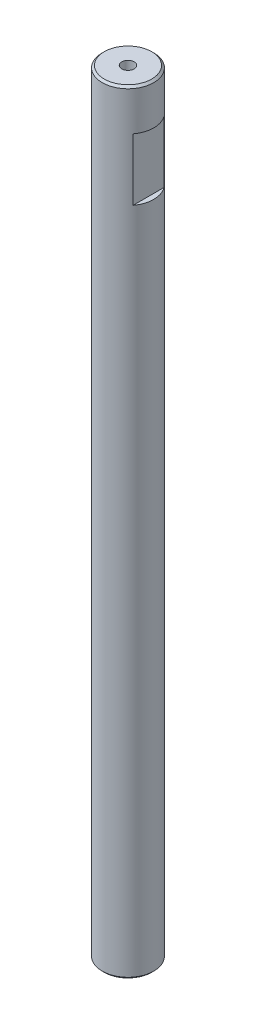
ISO-10303-21;
HEADER;
FILE_DESCRIPTION(('STEP AP214'),'2;1');
FILE_NAME('part.step','',(''),(''),'','','');
FILE_SCHEMA(('AUTOMOTIVE_DESIGN { 1 0 10303 214 1 1 1 1 }'));
ENDSEC;
DATA;
#1=APPLICATION_CONTEXT('core data for automotive mechanical design processes');
#2=APPLICATION_PROTOCOL_DEFINITION('international standard','automotive_design',2000,#1);
#3=PRODUCT_CONTEXT('',#1,'mechanical');
#4=PRODUCT('Part','Part','',(#3));
#5=PRODUCT_RELATED_PRODUCT_CATEGORY('part','',(#4));
#6=PRODUCT_DEFINITION_FORMATION('','',#4);
#7=PRODUCT_DEFINITION_CONTEXT('part definition',#1,'design');
#8=PRODUCT_DEFINITION('design','',#6,#7);
#9=PRODUCT_DEFINITION_SHAPE('','',#8);
#10=(LENGTH_UNIT() NAMED_UNIT(*) SI_UNIT(.MILLI.,.METRE.));
#11=(NAMED_UNIT(*) PLANE_ANGLE_UNIT() SI_UNIT($,.RADIAN.));
#12=(NAMED_UNIT(*) SI_UNIT($,.STERADIAN.) SOLID_ANGLE_UNIT());
#13=UNCERTAINTY_MEASURE_WITH_UNIT(LENGTH_MEASURE(1.E-05),#10,'distance_accuracy_value','');
#14=(GEOMETRIC_REPRESENTATION_CONTEXT(3) GLOBAL_UNCERTAINTY_ASSIGNED_CONTEXT((#13)) GLOBAL_UNIT_ASSIGNED_CONTEXT((#10,
#11,#12)) REPRESENTATION_CONTEXT('',''));
#15=CARTESIAN_POINT('',(0.,0.,0.));
#16=DIRECTION('',(0.,0.,1.));
#17=DIRECTION('',(1.,0.,0.));
#18=AXIS2_PLACEMENT_3D('',#15,#16,#17);
#19=CARTESIAN_POINT('',(-10.,325.,0.));
#20=DIRECTION('',(-1.,0.,0.));
#21=DIRECTION('',(0.,0.,1.));
#22=AXIS2_PLACEMENT_3D('',#19,#20,#21);
#23=PLANE('',#22);
#24=DIRECTION('',(0.,1.,0.));
#25=VECTOR('',#24,1.);
#26=CARTESIAN_POINT('',(-10.,325.,7.5));
#27=LINE('',#26,#25);
#28=CARTESIAN_POINT('',(-10.,325.,7.5));
#29=VERTEX_POINT('',#28);
#30=CARTESIAN_POINT('',(-10.,355.,7.5));
#31=VERTEX_POINT('',#30);
#32=EDGE_CURVE('E130',#29,#31,#27,.T.);
#33=ORIENTED_EDGE('',*,*,#32,.T.);
#34=DIRECTION('',(0.,0.,-1.));
#35=VECTOR('',#34,1.);
#36=CARTESIAN_POINT('',(-10.,355.,0.));
#37=LINE('',#36,#35);
#38=CARTESIAN_POINT('',(-10.,355.,-7.5));
#39=VERTEX_POINT('',#38);
#40=EDGE_CURVE('E83',#31,#39,#37,.T.);
#41=ORIENTED_EDGE('',*,*,#40,.T.);
#42=DIRECTION('',(0.,1.,0.));
#43=VECTOR('',#42,1.);
#44=CARTESIAN_POINT('',(-10.,325.,-7.5));
#45=LINE('',#44,#43);
#46=CARTESIAN_POINT('',(-10.,325.,-7.5));
#47=VERTEX_POINT('',#46);
#48=EDGE_CURVE('E77',#47,#39,#45,.T.);
#49=ORIENTED_EDGE('',*,*,#48,.F.);
#50=DIRECTION('',(0.,0.,1.));
#51=VECTOR('',#50,1.);
#52=CARTESIAN_POINT('',(-10.,325.,0.));
#53=LINE('',#52,#51);
#54=EDGE_CURVE('E123',#47,#29,#53,.T.);
#55=ORIENTED_EDGE('',*,*,#54,.T.);
#56=EDGE_LOOP('',(#33,#41,#49,#55));
#57=FACE_BOUND('',#56,.T.);
#58=ADVANCED_FACE('F47',(#57),#23,.T.);
#59=CARTESIAN_POINT('',(10.,325.,0.));
#60=DIRECTION('',(1.,0.,0.));
#61=DIRECTION('',(0.,0.,-1.));
#62=AXIS2_PLACEMENT_3D('',#59,#60,#61);
#63=PLANE('',#62);
#64=DIRECTION('',(0.,1.,0.));
#65=VECTOR('',#64,1.);
#66=CARTESIAN_POINT('',(10.,325.,-7.5));
#67=LINE('',#66,#65);
#68=CARTESIAN_POINT('',(10.,325.,-7.5));
#69=VERTEX_POINT('',#68);
#70=CARTESIAN_POINT('',(10.,355.,-7.5));
#71=VERTEX_POINT('',#70);
#72=EDGE_CURVE('E106',#69,#71,#67,.T.);
#73=ORIENTED_EDGE('',*,*,#72,.T.);
#74=DIRECTION('',(0.,0.,1.));
#75=VECTOR('',#74,1.);
#76=CARTESIAN_POINT('',(10.,355.,0.));
#77=LINE('',#76,#75);
#78=CARTESIAN_POINT('',(10.,355.,7.5));
#79=VERTEX_POINT('',#78);
#80=EDGE_CURVE('E97',#71,#79,#77,.T.);
#81=ORIENTED_EDGE('',*,*,#80,.T.);
#82=DIRECTION('',(0.,1.,0.));
#83=VECTOR('',#82,1.);
#84=CARTESIAN_POINT('',(10.,325.,7.5));
#85=LINE('',#84,#83);
#86=CARTESIAN_POINT('',(10.,325.,7.5));
#87=VERTEX_POINT('',#86);
#88=EDGE_CURVE('E105',#87,#79,#85,.T.);
#89=ORIENTED_EDGE('',*,*,#88,.F.);
#90=DIRECTION('',(0.,0.,-1.));
#91=VECTOR('',#90,1.);
#92=CARTESIAN_POINT('',(10.,325.,0.));
#93=LINE('',#92,#91);
#94=EDGE_CURVE('E66',#87,#69,#93,.T.);
#95=ORIENTED_EDGE('',*,*,#94,.T.);
#96=EDGE_LOOP('',(#73,#81,#89,#95));
#97=FACE_BOUND('',#96,.T.);
#98=ADVANCED_FACE('F104',(#97),#63,.T.);
#99=CARTESIAN_POINT('',(0.,375.,0.));
#100=DIRECTION('',(0.,-1.,0.));
#101=DIRECTION('',(0.,0.,-1.));
#102=AXIS2_PLACEMENT_3D('',#99,#100,#101);
#103=CYLINDRICAL_SURFACE('',#102,12.5);
#104=CARTESIAN_POINT('',(0.,374.,0.));
#105=DIRECTION('',(0.,1.,0.));
#106=DIRECTION('',(0.,0.,1.));
#107=AXIS2_PLACEMENT_3D('',#104,#105,#106);
#108=CIRCLE('',#107,12.5);
#109=CARTESIAN_POINT('',(0.,374.,12.5));
#110=VERTEX_POINT('',#109);
#111=EDGE_CURVE('E11',#110,#110,#108,.F.);
#112=ORIENTED_EDGE('',*,*,#111,.T.);
#113=EDGE_LOOP('',(#112));
#114=FACE_BOUND('',#113,.T.);
#115=CARTESIAN_POINT('',(0.,1.00000000000006,0.));
#116=DIRECTION('',(0.,1.,0.));
#117=DIRECTION('',(0.,0.,1.));
#118=AXIS2_PLACEMENT_3D('',#115,#116,#117);
#119=CIRCLE('',#118,12.5);
#120=CARTESIAN_POINT('',(0.,1.00000000000006,12.5));
#121=VERTEX_POINT('',#120);
#122=EDGE_CURVE('E108',#121,#121,#119,.T.);
#123=ORIENTED_EDGE('',*,*,#122,.T.);
#124=EDGE_LOOP('',(#123));
#125=FACE_BOUND('',#124,.T.);
#126=ORIENTED_EDGE('',*,*,#48,.T.);
#127=CARTESIAN_POINT('',(0.,355.,0.));
#128=DIRECTION('',(0.,1.,0.));
#129=DIRECTION('',(0.,0.,1.));
#130=AXIS2_PLACEMENT_3D('',#127,#128,#129);
#131=CIRCLE('',#130,12.5);
#132=EDGE_CURVE('E102',#39,#31,#131,.T.);
#133=ORIENTED_EDGE('',*,*,#132,.T.);
#134=ORIENTED_EDGE('',*,*,#32,.F.);
#135=CARTESIAN_POINT('',(0.,325.,0.));
#136=DIRECTION('',(0.,1.,0.));
#137=DIRECTION('',(0.,0.,1.));
#138=AXIS2_PLACEMENT_3D('',#135,#136,#137);
#139=CIRCLE('',#138,12.5);
#140=EDGE_CURVE('E126',#47,#29,#139,.T.);
#141=ORIENTED_EDGE('',*,*,#140,.F.);
#142=EDGE_LOOP('',(#126,#133,#134,#141));
#143=FACE_BOUND('',#142,.T.);
#144=EDGE_CURVE('E94',#79,#71,#131,.T.);
#145=ORIENTED_EDGE('',*,*,#144,.T.);
#146=ORIENTED_EDGE('',*,*,#72,.F.);
#147=CARTESIAN_POINT('',(0.,325.,0.));
#148=DIRECTION('',(0.,1.,0.));
#149=DIRECTION('',(0.,0.,1.));
#150=AXIS2_PLACEMENT_3D('',#147,#148,#149);
#151=CIRCLE('',#150,12.5);
#152=EDGE_CURVE('E113',#87,#69,#151,.T.);
#153=ORIENTED_EDGE('',*,*,#152,.F.);
#154=ORIENTED_EDGE('',*,*,#88,.T.);
#155=EDGE_LOOP('',(#145,#146,#153,#154));
#156=FACE_BOUND('',#155,.T.);
#157=ADVANCED_FACE('F112',(#114,#125,#143,#156),#103,.T.);
#158=CARTESIAN_POINT('',(0.,375.,0.));
#159=DIRECTION('',(0.,1.,0.));
#160=DIRECTION('',(0.,0.,1.));
#161=AXIS2_PLACEMENT_3D('',#158,#159,#160);
#162=PLANE('',#161);
#163=CARTESIAN_POINT('',(0.,375.,0.));
#164=DIRECTION('',(0.,1.,0.));
#165=DIRECTION('',(0.,0.,1.));
#166=AXIS2_PLACEMENT_3D('',#163,#164,#165);
#167=CIRCLE('',#166,11.5);
#168=CARTESIAN_POINT('',(0.,375.,11.5));
#169=VERTEX_POINT('',#168);
#170=EDGE_CURVE('E58',#169,#169,#167,.T.);
#171=ORIENTED_EDGE('',*,*,#170,.T.);
#172=EDGE_LOOP('',(#171));
#173=FACE_BOUND('',#172,.T.);
#174=CARTESIAN_POINT('',(0.,375.,0.));
#175=DIRECTION('',(0.,1.,0.));
#176=DIRECTION('',(0.,0.,1.));
#177=AXIS2_PLACEMENT_3D('',#174,#175,#176);
#178=CIRCLE('',#177,3.);
#179=CARTESIAN_POINT('',(0.,375.,3.));
#180=VERTEX_POINT('',#179);
#181=EDGE_CURVE('E216',#180,#180,#178,.T.);
#182=ORIENTED_EDGE('',*,*,#181,.F.);
#183=EDGE_LOOP('',(#182));
#184=FACE_BOUND('',#183,.T.);
#185=ADVANCED_FACE('F153',(#173,#184),#162,.T.);
#186=CARTESIAN_POINT('',(0.,0.,0.));
#187=DIRECTION('',(0.,1.,0.));
#188=DIRECTION('',(0.,0.,1.));
#189=AXIS2_PLACEMENT_3D('',#186,#187,#188);
#190=PLANE('',#189);
#191=CARTESIAN_POINT('',(0.,0.,0.));
#192=DIRECTION('',(0.,1.,0.));
#193=DIRECTION('',(0.,0.,1.));
#194=AXIS2_PLACEMENT_3D('',#191,#192,#193);
#195=CIRCLE('',#194,11.5);
#196=CARTESIAN_POINT('',(0.,0.,11.5));
#197=VERTEX_POINT('',#196);
#198=EDGE_CURVE('E145',#197,#197,#195,.F.);
#199=ORIENTED_EDGE('',*,*,#198,.T.);
#200=EDGE_LOOP('',(#199));
#201=FACE_BOUND('',#200,.T.);
#202=CARTESIAN_POINT('',(0.,0.,0.));
#203=DIRECTION('',(0.,-1.,0.));
#204=DIRECTION('',(0.,0.,-1.));
#205=AXIS2_PLACEMENT_3D('',#202,#203,#204);
#206=CIRCLE('',#205,3.);
#207=CARTESIAN_POINT('',(0.,0.,-3.));
#208=VERTEX_POINT('',#207);
#209=EDGE_CURVE('E119',#208,#208,#206,.T.);
#210=ORIENTED_EDGE('',*,*,#209,.F.);
#211=EDGE_LOOP('',(#210));
#212=FACE_BOUND('',#211,.T.);
#213=ADVANCED_FACE('F183',(#201,#212),#190,.F.);
#214=CARTESIAN_POINT('',(0.,20.,0.));
#215=DIRECTION('',(0.,-1.,0.));
#216=DIRECTION('',(0.,0.,-1.));
#217=AXIS2_PLACEMENT_3D('',#214,#215,#216);
#218=CYLINDRICAL_SURFACE('',#217,3.);
#219=CARTESIAN_POINT('',(0.,20.,0.));
#220=DIRECTION('',(0.,-1.,0.));
#221=DIRECTION('',(0.,0.,-1.));
#222=AXIS2_PLACEMENT_3D('',#219,#220,#221);
#223=CIRCLE('',#222,3.);
#224=CARTESIAN_POINT('',(0.,20.,-3.));
#225=VERTEX_POINT('',#224);
#226=EDGE_CURVE('E109',#225,#225,#223,.T.);
#227=ORIENTED_EDGE('',*,*,#226,.F.);
#228=EDGE_LOOP('',(#227));
#229=FACE_BOUND('',#228,.T.);
#230=ORIENTED_EDGE('',*,*,#209,.T.);
#231=EDGE_LOOP('',(#230));
#232=FACE_BOUND('',#231,.T.);
#233=ADVANCED_FACE('F179',(#229,#232),#218,.F.);
#234=CARTESIAN_POINT('',(0.,20.,0.));
#235=DIRECTION('',(0.,-1.,0.));
#236=DIRECTION('',(0.,0.,-1.));
#237=AXIS2_PLACEMENT_3D('',#234,#235,#236);
#238=PLANE('',#237);
#239=ORIENTED_EDGE('',*,*,#226,.T.);
#240=EDGE_LOOP('',(#239));
#241=FACE_BOUND('',#240,.T.);
#242=ADVANCED_FACE('F176',(#241),#238,.T.);
#243=CARTESIAN_POINT('',(0.,325.,0.));
#244=DIRECTION('',(0.,1.,0.));
#245=DIRECTION('',(0.,0.,1.));
#246=AXIS2_PLACEMENT_3D('',#243,#244,#245);
#247=PLANE('',#246);
#248=ORIENTED_EDGE('',*,*,#54,.F.);
#249=ORIENTED_EDGE('',*,*,#140,.T.);
#250=EDGE_LOOP('',(#248,#249));
#251=FACE_BOUND('',#250,.T.);
#252=ADVANCED_FACE('F175',(#251),#247,.T.);
#253=CARTESIAN_POINT('',(0.,325.,0.));
#254=DIRECTION('',(0.,1.,0.));
#255=DIRECTION('',(0.,0.,1.));
#256=AXIS2_PLACEMENT_3D('',#253,#254,#255);
#257=PLANE('',#256);
#258=ORIENTED_EDGE('',*,*,#94,.F.);
#259=ORIENTED_EDGE('',*,*,#152,.T.);
#260=EDGE_LOOP('',(#258,#259));
#261=FACE_BOUND('',#260,.T.);
#262=ADVANCED_FACE('F244',(#261),#257,.T.);
#263=CARTESIAN_POINT('',(0.,355.,0.));
#264=DIRECTION('',(0.,1.,0.));
#265=DIRECTION('',(0.,0.,1.));
#266=AXIS2_PLACEMENT_3D('',#263,#264,#265);
#267=PLANE('',#266);
#268=ORIENTED_EDGE('',*,*,#80,.F.);
#269=ORIENTED_EDGE('',*,*,#144,.F.);
#270=EDGE_LOOP('',(#268,#269));
#271=FACE_BOUND('',#270,.T.);
#272=ADVANCED_FACE('F96',(#271),#267,.F.);
#273=ORIENTED_EDGE('',*,*,#40,.F.);
#274=ORIENTED_EDGE('',*,*,#132,.F.);
#275=EDGE_LOOP('',(#273,#274));
#276=FACE_BOUND('',#275,.T.);
#277=ADVANCED_FACE('F233',(#276),#267,.F.);
#278=CARTESIAN_POINT('',(0.,355.,0.));
#279=DIRECTION('',(0.,1.,0.));
#280=DIRECTION('',(0.,0.,1.));
#281=AXIS2_PLACEMENT_3D('',#278,#279,#280);
#282=CYLINDRICAL_SURFACE('',#281,3.);
#283=CARTESIAN_POINT('',(0.,355.,0.));
#284=DIRECTION('',(0.,1.,0.));
#285=DIRECTION('',(0.,0.,1.));
#286=AXIS2_PLACEMENT_3D('',#283,#284,#285);
#287=CIRCLE('',#286,3.);
#288=CARTESIAN_POINT('',(0.,355.,3.));
#289=VERTEX_POINT('',#288);
#290=EDGE_CURVE('E220',#289,#289,#287,.T.);
#291=ORIENTED_EDGE('',*,*,#290,.F.);
#292=EDGE_LOOP('',(#291));
#293=FACE_BOUND('',#292,.T.);
#294=ORIENTED_EDGE('',*,*,#181,.T.);
#295=EDGE_LOOP('',(#294));
#296=FACE_BOUND('',#295,.T.);
#297=ADVANCED_FACE('F230',(#293,#296),#282,.F.);
#298=CARTESIAN_POINT('',(0.,355.,0.));
#299=DIRECTION('',(0.,1.,0.));
#300=DIRECTION('',(0.,0.,1.));
#301=AXIS2_PLACEMENT_3D('',#298,#299,#300);
#302=PLANE('',#301);
#303=ORIENTED_EDGE('',*,*,#290,.T.);
#304=EDGE_LOOP('',(#303));
#305=FACE_BOUND('',#304,.T.);
#306=ADVANCED_FACE('F163',(#305),#302,.T.);
#307=CARTESIAN_POINT('',(0.,1.00000000000006,0.));
#308=DIRECTION('',(0.,1.,0.));
#309=DIRECTION('',(0.,0.,1.));
#310=AXIS2_PLACEMENT_3D('',#307,#308,#309);
#311=CONICAL_SURFACE('',#310,12.5,0.785398163397443);
#312=ORIENTED_EDGE('',*,*,#198,.F.);
#313=EDGE_LOOP('',(#312));
#314=FACE_BOUND('',#313,.T.);
#315=ORIENTED_EDGE('',*,*,#122,.F.);
#316=EDGE_LOOP('',(#315));
#317=FACE_BOUND('',#316,.T.);
#318=ADVANCED_FACE('F157',(#314,#317),#311,.T.);
#319=CARTESIAN_POINT('',(0.,375.,0.));
#320=DIRECTION('',(0.,-1.,0.));
#321=DIRECTION('',(0.,0.,-1.));
#322=AXIS2_PLACEMENT_3D('',#319,#320,#321);
#323=CONICAL_SURFACE('',#322,11.5,0.785398163397471);
#324=ORIENTED_EDGE('',*,*,#111,.F.);
#325=EDGE_LOOP('',(#324));
#326=FACE_BOUND('',#325,.T.);
#327=ORIENTED_EDGE('',*,*,#170,.F.);
#328=EDGE_LOOP('',(#327));
#329=FACE_BOUND('',#328,.T.);
#330=ADVANCED_FACE('F50',(#326,#329),#323,.T.);
#331=CLOSED_SHELL('',(#58,#98,#157,#185,#213,#233,#242,#252,#262,#272,#277,#297,#306,#318,#330));
#332=MANIFOLD_SOLID_BREP('B2',#331);
#333=ADVANCED_BREP_SHAPE_REPRESENTATION('',(#18,#332),#14);
#334=SHAPE_DEFINITION_REPRESENTATION(#9,#333);
ENDSEC;
END-ISO-10303-21;
